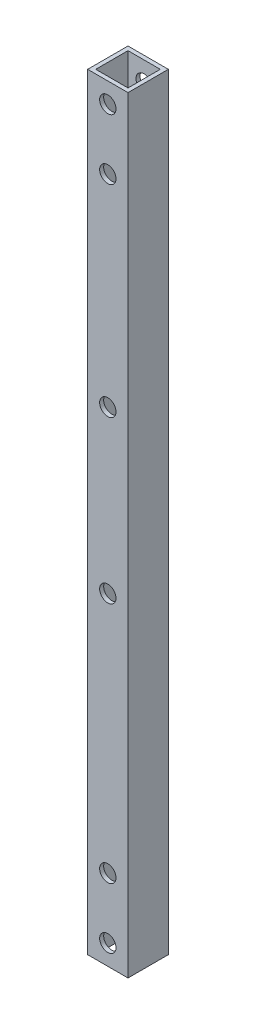
ISO-10303-21;
HEADER;
FILE_DESCRIPTION(('STEP AP214'),'2;1');
FILE_NAME('part.step','',(''),(''),'','','');
FILE_SCHEMA(('AUTOMOTIVE_DESIGN { 1 0 10303 214 1 1 1 1 }'));
ENDSEC;
DATA;
#1=APPLICATION_CONTEXT('core data for automotive mechanical design processes');
#2=APPLICATION_PROTOCOL_DEFINITION('international standard','automotive_design',2000,#1);
#3=PRODUCT_CONTEXT('',#1,'mechanical');
#4=PRODUCT('Part','Part','',(#3));
#5=PRODUCT_RELATED_PRODUCT_CATEGORY('part','',(#4));
#6=PRODUCT_DEFINITION_FORMATION('','',#4);
#7=PRODUCT_DEFINITION_CONTEXT('part definition',#1,'design');
#8=PRODUCT_DEFINITION('design','',#6,#7);
#9=PRODUCT_DEFINITION_SHAPE('','',#8);
#10=(LENGTH_UNIT() NAMED_UNIT(*) SI_UNIT(.MILLI.,.METRE.));
#11=(NAMED_UNIT(*) PLANE_ANGLE_UNIT() SI_UNIT($,.RADIAN.));
#12=(NAMED_UNIT(*) SI_UNIT($,.STERADIAN.) SOLID_ANGLE_UNIT());
#13=UNCERTAINTY_MEASURE_WITH_UNIT(LENGTH_MEASURE(1.E-05),#10,'distance_accuracy_value','');
#14=(GEOMETRIC_REPRESENTATION_CONTEXT(3) GLOBAL_UNCERTAINTY_ASSIGNED_CONTEXT((#13)) GLOBAL_UNIT_ASSIGNED_CONTEXT((#10,
#11,#12)) REPRESENTATION_CONTEXT('',''));
#15=CARTESIAN_POINT('',(0.,0.,0.));
#16=DIRECTION('',(0.,0.,1.));
#17=DIRECTION('',(1.,0.,0.));
#18=AXIS2_PLACEMENT_3D('',#15,#16,#17);
#19=CARTESIAN_POINT('',(0.,190.,0.));
#20=DIRECTION('',(0.,1.,0.));
#21=DIRECTION('',(0.,0.,1.));
#22=AXIS2_PLACEMENT_3D('',#19,#20,#21);
#23=PLANE('',#22);
#24=DIRECTION('',(0.,0.,-1.));
#25=VECTOR('',#24,1.);
#26=CARTESIAN_POINT('',(5.,190.,-5.));
#27=LINE('',#26,#25);
#28=CARTESIAN_POINT('',(5.,190.,5.));
#29=VERTEX_POINT('',#28);
#30=CARTESIAN_POINT('',(5.,190.,-5.));
#31=VERTEX_POINT('',#30);
#32=EDGE_CURVE('E157',#29,#31,#27,.T.);
#33=ORIENTED_EDGE('',*,*,#32,.T.);
#34=DIRECTION('',(-1.,0.,0.));
#35=VECTOR('',#34,1.);
#36=CARTESIAN_POINT('',(-5.,190.,-5.));
#37=LINE('',#36,#35);
#38=CARTESIAN_POINT('',(-5.,190.,-5.));
#39=VERTEX_POINT('',#38);
#40=EDGE_CURVE('E161',#31,#39,#37,.T.);
#41=ORIENTED_EDGE('',*,*,#40,.T.);
#42=DIRECTION('',(0.,0.,1.));
#43=VECTOR('',#42,1.);
#44=CARTESIAN_POINT('',(-5.,190.,-5.));
#45=LINE('',#44,#43);
#46=CARTESIAN_POINT('',(-5.,190.,5.));
#47=VERTEX_POINT('',#46);
#48=EDGE_CURVE('E165',#39,#47,#45,.T.);
#49=ORIENTED_EDGE('',*,*,#48,.T.);
#50=DIRECTION('',(1.,0.,0.));
#51=VECTOR('',#50,1.);
#52=CARTESIAN_POINT('',(-5.,190.,5.));
#53=LINE('',#52,#51);
#54=EDGE_CURVE('E168',#47,#29,#53,.T.);
#55=ORIENTED_EDGE('',*,*,#54,.T.);
#56=EDGE_LOOP('',(#33,#41,#49,#55));
#57=FACE_BOUND('',#56,.T.);
#58=DIRECTION('',(-1.,0.,0.));
#59=VECTOR('',#58,1.);
#60=CARTESIAN_POINT('',(-4.,190.,-4.));
#61=LINE('',#60,#59);
#62=CARTESIAN_POINT('',(4.,190.,-4.));
#63=VERTEX_POINT('',#62);
#64=CARTESIAN_POINT('',(-4.,190.,-4.));
#65=VERTEX_POINT('',#64);
#66=EDGE_CURVE('E116',#63,#65,#61,.T.);
#67=ORIENTED_EDGE('',*,*,#66,.F.);
#68=DIRECTION('',(0.,0.,-1.));
#69=VECTOR('',#68,1.);
#70=CARTESIAN_POINT('',(4.,190.,-4.));
#71=LINE('',#70,#69);
#72=CARTESIAN_POINT('',(4.,190.,4.));
#73=VERTEX_POINT('',#72);
#74=EDGE_CURVE('E107',#73,#63,#71,.T.);
#75=ORIENTED_EDGE('',*,*,#74,.F.);
#76=DIRECTION('',(1.,0.,0.));
#77=VECTOR('',#76,1.);
#78=CARTESIAN_POINT('',(-4.,190.,4.));
#79=LINE('',#78,#77);
#80=CARTESIAN_POINT('',(-4.,190.,4.));
#81=VERTEX_POINT('',#80);
#82=EDGE_CURVE('E133',#81,#73,#79,.T.);
#83=ORIENTED_EDGE('',*,*,#82,.F.);
#84=DIRECTION('',(0.,0.,1.));
#85=VECTOR('',#84,1.);
#86=CARTESIAN_POINT('',(-4.,190.,-4.));
#87=LINE('',#86,#85);
#88=EDGE_CURVE('E129',#65,#81,#87,.T.);
#89=ORIENTED_EDGE('',*,*,#88,.F.);
#90=EDGE_LOOP('',(#67,#75,#83,#89));
#91=FACE_BOUND('',#90,.T.);
#92=ADVANCED_FACE('F39',(#57,#91),#23,.T.);
#93=CARTESIAN_POINT('',(0.,0.,0.));
#94=DIRECTION('',(0.,1.,0.));
#95=DIRECTION('',(0.,0.,1.));
#96=AXIS2_PLACEMENT_3D('',#93,#94,#95);
#97=PLANE('',#96);
#98=DIRECTION('',(0.,0.,-1.));
#99=VECTOR('',#98,1.);
#100=CARTESIAN_POINT('',(5.,0.,-5.));
#101=LINE('',#100,#99);
#102=CARTESIAN_POINT('',(5.,0.,5.));
#103=VERTEX_POINT('',#102);
#104=CARTESIAN_POINT('',(5.,0.,-5.));
#105=VERTEX_POINT('',#104);
#106=EDGE_CURVE('E125',#103,#105,#101,.T.);
#107=ORIENTED_EDGE('',*,*,#106,.F.);
#108=DIRECTION('',(1.,0.,0.));
#109=VECTOR('',#108,1.);
#110=CARTESIAN_POINT('',(-5.,0.,5.));
#111=LINE('',#110,#109);
#112=CARTESIAN_POINT('',(-5.,0.,5.));
#113=VERTEX_POINT('',#112);
#114=EDGE_CURVE('E162',#113,#103,#111,.T.);
#115=ORIENTED_EDGE('',*,*,#114,.F.);
#116=DIRECTION('',(0.,0.,1.));
#117=VECTOR('',#116,1.);
#118=CARTESIAN_POINT('',(-5.,0.,-5.));
#119=LINE('',#118,#117);
#120=CARTESIAN_POINT('',(-5.,0.,-5.));
#121=VERTEX_POINT('',#120);
#122=EDGE_CURVE('E178',#121,#113,#119,.T.);
#123=ORIENTED_EDGE('',*,*,#122,.F.);
#124=DIRECTION('',(-1.,0.,0.));
#125=VECTOR('',#124,1.);
#126=CARTESIAN_POINT('',(-5.,0.,-5.));
#127=LINE('',#126,#125);
#128=EDGE_CURVE('E175',#105,#121,#127,.T.);
#129=ORIENTED_EDGE('',*,*,#128,.F.);
#130=EDGE_LOOP('',(#107,#115,#123,#129));
#131=FACE_BOUND('',#130,.T.);
#132=DIRECTION('',(0.,0.,-1.));
#133=VECTOR('',#132,1.);
#134=CARTESIAN_POINT('',(4.,0.,-4.));
#135=LINE('',#134,#133);
#136=CARTESIAN_POINT('',(4.,0.,4.));
#137=VERTEX_POINT('',#136);
#138=CARTESIAN_POINT('',(4.,0.,-4.));
#139=VERTEX_POINT('',#138);
#140=EDGE_CURVE('E65',#137,#139,#135,.T.);
#141=ORIENTED_EDGE('',*,*,#140,.T.);
#142=DIRECTION('',(-1.,0.,0.));
#143=VECTOR('',#142,1.);
#144=CARTESIAN_POINT('',(-4.,0.,-4.));
#145=LINE('',#144,#143);
#146=CARTESIAN_POINT('',(-4.,0.,-4.));
#147=VERTEX_POINT('',#146);
#148=EDGE_CURVE('E123',#139,#147,#145,.T.);
#149=ORIENTED_EDGE('',*,*,#148,.T.);
#150=DIRECTION('',(0.,0.,1.));
#151=VECTOR('',#150,1.);
#152=CARTESIAN_POINT('',(-4.,0.,-4.));
#153=LINE('',#152,#151);
#154=CARTESIAN_POINT('',(-4.,0.,4.));
#155=VERTEX_POINT('',#154);
#156=EDGE_CURVE('E144',#147,#155,#153,.T.);
#157=ORIENTED_EDGE('',*,*,#156,.T.);
#158=DIRECTION('',(1.,0.,0.));
#159=VECTOR('',#158,1.);
#160=CARTESIAN_POINT('',(-4.,0.,4.));
#161=LINE('',#160,#159);
#162=EDGE_CURVE('E117',#155,#137,#161,.T.);
#163=ORIENTED_EDGE('',*,*,#162,.T.);
#164=EDGE_LOOP('',(#141,#149,#157,#163));
#165=FACE_BOUND('',#164,.T.);
#166=ADVANCED_FACE('F287',(#131,#165),#97,.F.);
#167=CARTESIAN_POINT('',(5.,190.,-5.));
#168=DIRECTION('',(-1.,0.,0.));
#169=DIRECTION('',(0.,0.,1.));
#170=AXIS2_PLACEMENT_3D('',#167,#168,#169);
#171=PLANE('',#170);
#172=ORIENTED_EDGE('',*,*,#106,.T.);
#173=DIRECTION('',(0.,-1.,0.));
#174=VECTOR('',#173,1.);
#175=CARTESIAN_POINT('',(5.,190.,-5.));
#176=LINE('',#175,#174);
#177=EDGE_CURVE('E11',#31,#105,#176,.T.);
#178=ORIENTED_EDGE('',*,*,#177,.F.);
#179=ORIENTED_EDGE('',*,*,#32,.F.);
#180=DIRECTION('',(0.,-1.,0.));
#181=VECTOR('',#180,1.);
#182=CARTESIAN_POINT('',(5.,190.,5.));
#183=LINE('',#182,#181);
#184=EDGE_CURVE('E171',#29,#103,#183,.T.);
#185=ORIENTED_EDGE('',*,*,#184,.T.);
#186=EDGE_LOOP('',(#172,#178,#179,#185));
#187=FACE_BOUND('',#186,.T.);
#188=ADVANCED_FACE('F41',(#187),#171,.F.);
#189=CARTESIAN_POINT('',(-5.,190.,-5.));
#190=DIRECTION('',(0.,0.,1.));
#191=DIRECTION('',(1.,0.,0.));
#192=AXIS2_PLACEMENT_3D('',#189,#190,#191);
#193=PLANE('',#192);
#194=CARTESIAN_POINT('',(0.,185.,-5.));
#195=DIRECTION('',(0.,0.,1.));
#196=DIRECTION('',(1.,0.,0.));
#197=AXIS2_PLACEMENT_3D('',#194,#195,#196);
#198=CIRCLE('',#197,2.02499999999995);
#199=CARTESIAN_POINT('',(2.02499999999997,185.,-5.));
#200=VERTEX_POINT('',#199);
#201=EDGE_CURVE('E208',#200,#200,#198,.T.);
#202=ORIENTED_EDGE('',*,*,#201,.T.);
#203=EDGE_LOOP('',(#202));
#204=FACE_BOUND('',#203,.T.);
#205=CARTESIAN_POINT('',(0.,20.,-5.));
#206=DIRECTION('',(0.,0.,1.));
#207=DIRECTION('',(1.,0.,0.));
#208=AXIS2_PLACEMENT_3D('',#205,#206,#207);
#209=CIRCLE('',#208,2.025);
#210=CARTESIAN_POINT('',(2.02500000000004,20.,-5.));
#211=VERTEX_POINT('',#210);
#212=EDGE_CURVE('E491',#211,#211,#209,.T.);
#213=ORIENTED_EDGE('',*,*,#212,.T.);
#214=EDGE_LOOP('',(#213));
#215=FACE_BOUND('',#214,.T.);
#216=CARTESIAN_POINT('',(0.,5.,-5.));
#217=DIRECTION('',(0.,0.,1.));
#218=DIRECTION('',(1.,0.,0.));
#219=AXIS2_PLACEMENT_3D('',#216,#217,#218);
#220=CIRCLE('',#219,2.025);
#221=CARTESIAN_POINT('',(2.02500000000004,5.,-5.));
#222=VERTEX_POINT('',#221);
#223=EDGE_CURVE('E507',#222,#222,#220,.T.);
#224=ORIENTED_EDGE('',*,*,#223,.T.);
#225=EDGE_LOOP('',(#224));
#226=FACE_BOUND('',#225,.T.);
#227=CARTESIAN_POINT('',(0.,170.,-5.));
#228=DIRECTION('',(0.,0.,1.));
#229=DIRECTION('',(1.,0.,0.));
#230=AXIS2_PLACEMENT_3D('',#227,#228,#229);
#231=CIRCLE('',#230,2.02499999999995);
#232=CARTESIAN_POINT('',(2.02499999999997,170.,-5.));
#233=VERTEX_POINT('',#232);
#234=EDGE_CURVE('E488',#233,#233,#231,.T.);
#235=ORIENTED_EDGE('',*,*,#234,.T.);
#236=EDGE_LOOP('',(#235));
#237=FACE_BOUND('',#236,.T.);
#238=CARTESIAN_POINT('',(0.,120.,-5.));
#239=DIRECTION('',(0.,0.,1.));
#240=DIRECTION('',(1.,0.,0.));
#241=AXIS2_PLACEMENT_3D('',#238,#239,#240);
#242=CIRCLE('',#241,2.02500000000001);
#243=CARTESIAN_POINT('',(2.02500000000003,120.,-5.));
#244=VERTEX_POINT('',#243);
#245=EDGE_CURVE('E198',#244,#244,#242,.T.);
#246=ORIENTED_EDGE('',*,*,#245,.T.);
#247=EDGE_LOOP('',(#246));
#248=FACE_BOUND('',#247,.T.);
#249=CARTESIAN_POINT('',(0.,80.,-5.));
#250=DIRECTION('',(0.,0.,1.));
#251=DIRECTION('',(1.,0.,0.));
#252=AXIS2_PLACEMENT_3D('',#249,#250,#251);
#253=CIRCLE('',#252,2.02500000000001);
#254=CARTESIAN_POINT('',(2.02500000000003,80.,-5.));
#255=VERTEX_POINT('',#254);
#256=EDGE_CURVE('E242',#255,#255,#253,.T.);
#257=ORIENTED_EDGE('',*,*,#256,.T.);
#258=EDGE_LOOP('',(#257));
#259=FACE_BOUND('',#258,.T.);
#260=ORIENTED_EDGE('',*,*,#128,.T.);
#261=DIRECTION('',(0.,-1.,0.));
#262=VECTOR('',#261,1.);
#263=CARTESIAN_POINT('',(-5.,190.,-5.));
#264=LINE('',#263,#262);
#265=EDGE_CURVE('E49',#39,#121,#264,.T.);
#266=ORIENTED_EDGE('',*,*,#265,.F.);
#267=ORIENTED_EDGE('',*,*,#40,.F.);
#268=ORIENTED_EDGE('',*,*,#177,.T.);
#269=EDGE_LOOP('',(#260,#266,#267,#268));
#270=FACE_BOUND('',#269,.T.);
#271=ADVANCED_FACE('F273',(#204,#215,#226,#237,#248,#259,#270),#193,.F.);
#272=CARTESIAN_POINT('',(-5.,190.,-5.));
#273=DIRECTION('',(1.,0.,0.));
#274=DIRECTION('',(0.,0.,-1.));
#275=AXIS2_PLACEMENT_3D('',#272,#273,#274);
#276=PLANE('',#275);
#277=ORIENTED_EDGE('',*,*,#122,.T.);
#278=DIRECTION('',(0.,-1.,0.));
#279=VECTOR('',#278,1.);
#280=CARTESIAN_POINT('',(-5.,190.,5.));
#281=LINE('',#280,#279);
#282=EDGE_CURVE('E186',#47,#113,#281,.T.);
#283=ORIENTED_EDGE('',*,*,#282,.F.);
#284=ORIENTED_EDGE('',*,*,#48,.F.);
#285=ORIENTED_EDGE('',*,*,#265,.T.);
#286=EDGE_LOOP('',(#277,#283,#284,#285));
#287=FACE_BOUND('',#286,.T.);
#288=ADVANCED_FACE('F276',(#287),#276,.F.);
#289=CARTESIAN_POINT('',(-5.,190.,5.));
#290=DIRECTION('',(0.,0.,-1.));
#291=DIRECTION('',(-1.,0.,0.));
#292=AXIS2_PLACEMENT_3D('',#289,#290,#291);
#293=PLANE('',#292);
#294=CARTESIAN_POINT('',(0.,185.,5.));
#295=DIRECTION('',(0.,0.,1.));
#296=DIRECTION('',(1.,0.,0.));
#297=AXIS2_PLACEMENT_3D('',#294,#295,#296);
#298=CIRCLE('',#297,2.02499999999995);
#299=CARTESIAN_POINT('',(2.02499999999997,185.,5.));
#300=VERTEX_POINT('',#299);
#301=EDGE_CURVE('E484',#300,#300,#298,.T.);
#302=ORIENTED_EDGE('',*,*,#301,.F.);
#303=EDGE_LOOP('',(#302));
#304=FACE_BOUND('',#303,.T.);
#305=CARTESIAN_POINT('',(0.,20.,5.));
#306=DIRECTION('',(0.,0.,1.));
#307=DIRECTION('',(1.,0.,0.));
#308=AXIS2_PLACEMENT_3D('',#305,#306,#307);
#309=CIRCLE('',#308,2.025);
#310=CARTESIAN_POINT('',(2.02500000000004,20.,5.));
#311=VERTEX_POINT('',#310);
#312=EDGE_CURVE('E496',#311,#311,#309,.T.);
#313=ORIENTED_EDGE('',*,*,#312,.F.);
#314=EDGE_LOOP('',(#313));
#315=FACE_BOUND('',#314,.T.);
#316=CARTESIAN_POINT('',(0.,5.,5.));
#317=DIRECTION('',(0.,0.,1.));
#318=DIRECTION('',(1.,0.,0.));
#319=AXIS2_PLACEMENT_3D('',#316,#317,#318);
#320=CIRCLE('',#319,2.025);
#321=CARTESIAN_POINT('',(2.02500000000004,5.,5.));
#322=VERTEX_POINT('',#321);
#323=EDGE_CURVE('E495',#322,#322,#320,.T.);
#324=ORIENTED_EDGE('',*,*,#323,.F.);
#325=EDGE_LOOP('',(#324));
#326=FACE_BOUND('',#325,.T.);
#327=CARTESIAN_POINT('',(0.,170.,5.));
#328=DIRECTION('',(0.,0.,1.));
#329=DIRECTION('',(1.,0.,0.));
#330=AXIS2_PLACEMENT_3D('',#327,#328,#329);
#331=CIRCLE('',#330,2.02499999999995);
#332=CARTESIAN_POINT('',(2.02499999999997,170.,5.));
#333=VERTEX_POINT('',#332);
#334=EDGE_CURVE('E503',#333,#333,#331,.T.);
#335=ORIENTED_EDGE('',*,*,#334,.F.);
#336=EDGE_LOOP('',(#335));
#337=FACE_BOUND('',#336,.T.);
#338=CARTESIAN_POINT('',(0.,120.,5.));
#339=DIRECTION('',(0.,0.,1.));
#340=DIRECTION('',(1.,0.,0.));
#341=AXIS2_PLACEMENT_3D('',#338,#339,#340);
#342=CIRCLE('',#341,2.02500000000001);
#343=CARTESIAN_POINT('',(2.02500000000003,120.,5.));
#344=VERTEX_POINT('',#343);
#345=EDGE_CURVE('E238',#344,#344,#342,.T.);
#346=ORIENTED_EDGE('',*,*,#345,.F.);
#347=EDGE_LOOP('',(#346));
#348=FACE_BOUND('',#347,.T.);
#349=CARTESIAN_POINT('',(0.,80.,5.));
#350=DIRECTION('',(0.,0.,1.));
#351=DIRECTION('',(1.,0.,0.));
#352=AXIS2_PLACEMENT_3D('',#349,#350,#351);
#353=CIRCLE('',#352,2.02500000000001);
#354=CARTESIAN_POINT('',(2.02500000000003,80.,5.));
#355=VERTEX_POINT('',#354);
#356=EDGE_CURVE('E234',#355,#355,#353,.T.);
#357=ORIENTED_EDGE('',*,*,#356,.F.);
#358=EDGE_LOOP('',(#357));
#359=FACE_BOUND('',#358,.T.);
#360=ORIENTED_EDGE('',*,*,#114,.T.);
#361=ORIENTED_EDGE('',*,*,#184,.F.);
#362=ORIENTED_EDGE('',*,*,#54,.F.);
#363=ORIENTED_EDGE('',*,*,#282,.T.);
#364=EDGE_LOOP('',(#360,#361,#362,#363));
#365=FACE_BOUND('',#364,.T.);
#366=ADVANCED_FACE('F291',(#304,#315,#326,#337,#348,#359,#365),#293,.F.);
#367=CARTESIAN_POINT('',(4.,190.,-4.));
#368=DIRECTION('',(-1.,0.,0.));
#369=DIRECTION('',(0.,0.,1.));
#370=AXIS2_PLACEMENT_3D('',#367,#368,#369);
#371=PLANE('',#370);
#372=ORIENTED_EDGE('',*,*,#140,.F.);
#373=DIRECTION('',(0.,-1.,0.));
#374=VECTOR('',#373,1.);
#375=CARTESIAN_POINT('',(4.,190.,4.));
#376=LINE('',#375,#374);
#377=EDGE_CURVE('E111',#73,#137,#376,.T.);
#378=ORIENTED_EDGE('',*,*,#377,.F.);
#379=ORIENTED_EDGE('',*,*,#74,.T.);
#380=DIRECTION('',(0.,-1.,0.));
#381=VECTOR('',#380,1.);
#382=CARTESIAN_POINT('',(4.,190.,-4.));
#383=LINE('',#382,#381);
#384=EDGE_CURVE('E110',#63,#139,#383,.T.);
#385=ORIENTED_EDGE('',*,*,#384,.T.);
#386=EDGE_LOOP('',(#372,#378,#379,#385));
#387=FACE_BOUND('',#386,.T.);
#388=ADVANCED_FACE('F109',(#387),#371,.T.);
#389=CARTESIAN_POINT('',(-4.,190.,-4.));
#390=DIRECTION('',(0.,0.,1.));
#391=DIRECTION('',(1.,0.,0.));
#392=AXIS2_PLACEMENT_3D('',#389,#390,#391);
#393=PLANE('',#392);
#394=CARTESIAN_POINT('',(0.,185.,-4.));
#395=DIRECTION('',(0.,0.,1.));
#396=DIRECTION('',(1.,0.,0.));
#397=AXIS2_PLACEMENT_3D('',#394,#395,#396);
#398=CIRCLE('',#397,2.02499999999995);
#399=CARTESIAN_POINT('',(2.02499999999997,185.,-4.));
#400=VERTEX_POINT('',#399);
#401=EDGE_CURVE('E230',#400,#400,#398,.T.);
#402=ORIENTED_EDGE('',*,*,#401,.F.);
#403=EDGE_LOOP('',(#402));
#404=FACE_BOUND('',#403,.T.);
#405=CARTESIAN_POINT('',(0.,20.,-4.));
#406=DIRECTION('',(0.,0.,1.));
#407=DIRECTION('',(1.,0.,0.));
#408=AXIS2_PLACEMENT_3D('',#405,#406,#407);
#409=CIRCLE('',#408,2.025);
#410=CARTESIAN_POINT('',(2.02500000000004,20.,-4.));
#411=VERTEX_POINT('',#410);
#412=EDGE_CURVE('E216',#411,#411,#409,.T.);
#413=ORIENTED_EDGE('',*,*,#412,.F.);
#414=EDGE_LOOP('',(#413));
#415=FACE_BOUND('',#414,.T.);
#416=CARTESIAN_POINT('',(0.,5.,-4.));
#417=DIRECTION('',(0.,0.,1.));
#418=DIRECTION('',(1.,0.,0.));
#419=AXIS2_PLACEMENT_3D('',#416,#417,#418);
#420=CIRCLE('',#419,2.025);
#421=CARTESIAN_POINT('',(2.02500000000004,5.,-4.));
#422=VERTEX_POINT('',#421);
#423=EDGE_CURVE('E212',#422,#422,#420,.T.);
#424=ORIENTED_EDGE('',*,*,#423,.F.);
#425=EDGE_LOOP('',(#424));
#426=FACE_BOUND('',#425,.T.);
#427=CARTESIAN_POINT('',(0.,170.,-4.));
#428=DIRECTION('',(0.,0.,1.));
#429=DIRECTION('',(1.,0.,0.));
#430=AXIS2_PLACEMENT_3D('',#427,#428,#429);
#431=CIRCLE('',#430,2.02499999999995);
#432=CARTESIAN_POINT('',(2.02499999999997,170.,-4.));
#433=VERTEX_POINT('',#432);
#434=EDGE_CURVE('E207',#433,#433,#431,.T.);
#435=ORIENTED_EDGE('',*,*,#434,.F.);
#436=EDGE_LOOP('',(#435));
#437=FACE_BOUND('',#436,.T.);
#438=CARTESIAN_POINT('',(0.,120.,-4.));
#439=DIRECTION('',(0.,0.,1.));
#440=DIRECTION('',(1.,0.,0.));
#441=AXIS2_PLACEMENT_3D('',#438,#439,#440);
#442=CIRCLE('',#441,2.02500000000001);
#443=CARTESIAN_POINT('',(2.02500000000003,120.,-4.));
#444=VERTEX_POINT('',#443);
#445=EDGE_CURVE('E141',#444,#444,#442,.T.);
#446=ORIENTED_EDGE('',*,*,#445,.F.);
#447=EDGE_LOOP('',(#446));
#448=FACE_BOUND('',#447,.T.);
#449=CARTESIAN_POINT('',(0.,80.,-4.));
#450=DIRECTION('',(0.,0.,1.));
#451=DIRECTION('',(1.,0.,0.));
#452=AXIS2_PLACEMENT_3D('',#449,#450,#451);
#453=CIRCLE('',#452,2.02500000000001);
#454=CARTESIAN_POINT('',(2.02500000000003,80.,-4.));
#455=VERTEX_POINT('',#454);
#456=EDGE_CURVE('E197',#455,#455,#453,.T.);
#457=ORIENTED_EDGE('',*,*,#456,.F.);
#458=EDGE_LOOP('',(#457));
#459=FACE_BOUND('',#458,.T.);
#460=ORIENTED_EDGE('',*,*,#148,.F.);
#461=ORIENTED_EDGE('',*,*,#384,.F.);
#462=ORIENTED_EDGE('',*,*,#66,.T.);
#463=DIRECTION('',(0.,-1.,0.));
#464=VECTOR('',#463,1.);
#465=CARTESIAN_POINT('',(-4.,190.,-4.));
#466=LINE('',#465,#464);
#467=EDGE_CURVE('E126',#65,#147,#466,.T.);
#468=ORIENTED_EDGE('',*,*,#467,.T.);
#469=EDGE_LOOP('',(#460,#461,#462,#468));
#470=FACE_BOUND('',#469,.T.);
#471=ADVANCED_FACE('F120',(#404,#415,#426,#437,#448,#459,#470),#393,.T.);
#472=CARTESIAN_POINT('',(-4.,190.,-4.));
#473=DIRECTION('',(1.,0.,0.));
#474=DIRECTION('',(0.,0.,-1.));
#475=AXIS2_PLACEMENT_3D('',#472,#473,#474);
#476=PLANE('',#475);
#477=ORIENTED_EDGE('',*,*,#156,.F.);
#478=ORIENTED_EDGE('',*,*,#467,.F.);
#479=ORIENTED_EDGE('',*,*,#88,.T.);
#480=DIRECTION('',(0.,-1.,0.));
#481=VECTOR('',#480,1.);
#482=CARTESIAN_POINT('',(-4.,190.,4.));
#483=LINE('',#482,#481);
#484=EDGE_CURVE('E57',#81,#155,#483,.T.);
#485=ORIENTED_EDGE('',*,*,#484,.T.);
#486=EDGE_LOOP('',(#477,#478,#479,#485));
#487=FACE_BOUND('',#486,.T.);
#488=ADVANCED_FACE('F260',(#487),#476,.T.);
#489=CARTESIAN_POINT('',(-4.,190.,4.));
#490=DIRECTION('',(0.,0.,-1.));
#491=DIRECTION('',(-1.,0.,0.));
#492=AXIS2_PLACEMENT_3D('',#489,#490,#491);
#493=PLANE('',#492);
#494=CARTESIAN_POINT('',(0.,185.,4.));
#495=DIRECTION('',(0.,0.,-1.));
#496=DIRECTION('',(-1.,0.,0.));
#497=AXIS2_PLACEMENT_3D('',#494,#495,#496);
#498=CIRCLE('',#497,2.02499999999995);
#499=CARTESIAN_POINT('',(-2.02499999999994,185.,4.));
#500=VERTEX_POINT('',#499);
#501=EDGE_CURVE('E43',#500,#500,#498,.T.);
#502=ORIENTED_EDGE('',*,*,#501,.F.);
#503=EDGE_LOOP('',(#502));
#504=FACE_BOUND('',#503,.T.);
#505=CARTESIAN_POINT('',(0.,20.,4.));
#506=DIRECTION('',(0.,0.,-1.));
#507=DIRECTION('',(-1.,0.,0.));
#508=AXIS2_PLACEMENT_3D('',#505,#506,#507);
#509=CIRCLE('',#508,2.025);
#510=CARTESIAN_POINT('',(-2.02499999999996,20.,4.));
#511=VERTEX_POINT('',#510);
#512=EDGE_CURVE('E213',#511,#511,#509,.T.);
#513=ORIENTED_EDGE('',*,*,#512,.F.);
#514=EDGE_LOOP('',(#513));
#515=FACE_BOUND('',#514,.T.);
#516=CARTESIAN_POINT('',(0.,5.,4.));
#517=DIRECTION('',(0.,0.,-1.));
#518=DIRECTION('',(-1.,0.,0.));
#519=AXIS2_PLACEMENT_3D('',#516,#517,#518);
#520=CIRCLE('',#519,2.025);
#521=CARTESIAN_POINT('',(-2.02499999999996,5.,4.));
#522=VERTEX_POINT('',#521);
#523=EDGE_CURVE('E209',#522,#522,#520,.T.);
#524=ORIENTED_EDGE('',*,*,#523,.F.);
#525=EDGE_LOOP('',(#524));
#526=FACE_BOUND('',#525,.T.);
#527=CARTESIAN_POINT('',(0.,170.,4.));
#528=DIRECTION('',(0.,0.,-1.));
#529=DIRECTION('',(-1.,0.,0.));
#530=AXIS2_PLACEMENT_3D('',#527,#528,#529);
#531=CIRCLE('',#530,2.02499999999995);
#532=CARTESIAN_POINT('',(-2.02499999999993,170.,4.));
#533=VERTEX_POINT('',#532);
#534=EDGE_CURVE('E203',#533,#533,#531,.T.);
#535=ORIENTED_EDGE('',*,*,#534,.F.);
#536=EDGE_LOOP('',(#535));
#537=FACE_BOUND('',#536,.T.);
#538=CARTESIAN_POINT('',(0.,120.,4.));
#539=DIRECTION('',(0.,0.,-1.));
#540=DIRECTION('',(-1.,0.,0.));
#541=AXIS2_PLACEMENT_3D('',#538,#539,#540);
#542=CIRCLE('',#541,2.02500000000001);
#543=CARTESIAN_POINT('',(-2.02499999999999,120.,4.));
#544=VERTEX_POINT('',#543);
#545=EDGE_CURVE('E199',#544,#544,#542,.T.);
#546=ORIENTED_EDGE('',*,*,#545,.F.);
#547=EDGE_LOOP('',(#546));
#548=FACE_BOUND('',#547,.T.);
#549=CARTESIAN_POINT('',(0.,80.,4.));
#550=DIRECTION('',(0.,0.,-1.));
#551=DIRECTION('',(-1.,0.,0.));
#552=AXIS2_PLACEMENT_3D('',#549,#550,#551);
#553=CIRCLE('',#552,2.02500000000001);
#554=CARTESIAN_POINT('',(-2.02499999999998,80.,4.));
#555=VERTEX_POINT('',#554);
#556=EDGE_CURVE('E193',#555,#555,#553,.T.);
#557=ORIENTED_EDGE('',*,*,#556,.F.);
#558=EDGE_LOOP('',(#557));
#559=FACE_BOUND('',#558,.T.);
#560=ORIENTED_EDGE('',*,*,#162,.F.);
#561=ORIENTED_EDGE('',*,*,#484,.F.);
#562=ORIENTED_EDGE('',*,*,#82,.T.);
#563=ORIENTED_EDGE('',*,*,#377,.T.);
#564=EDGE_LOOP('',(#560,#561,#562,#563));
#565=FACE_BOUND('',#564,.T.);
#566=ADVANCED_FACE('F334',(#504,#515,#526,#537,#548,#559,#565),#493,.T.);
#567=CARTESIAN_POINT('',(0.,80.,-5.));
#568=DIRECTION('',(0.,0.,1.));
#569=DIRECTION('',(1.,0.,0.));
#570=AXIS2_PLACEMENT_3D('',#567,#568,#569);
#571=CYLINDRICAL_SURFACE('',#570,2.02500000000001);
#572=ORIENTED_EDGE('',*,*,#556,.T.);
#573=EDGE_LOOP('',(#572));
#574=FACE_BOUND('',#573,.T.);
#575=ORIENTED_EDGE('',*,*,#356,.T.);
#576=EDGE_LOOP('',(#575));
#577=FACE_BOUND('',#576,.T.);
#578=ADVANCED_FACE('F270',(#574,#577),#571,.F.);
#579=CARTESIAN_POINT('',(0.,120.,-5.));
#580=DIRECTION('',(0.,0.,1.));
#581=DIRECTION('',(1.,0.,0.));
#582=AXIS2_PLACEMENT_3D('',#579,#580,#581);
#583=CYLINDRICAL_SURFACE('',#582,2.02500000000001);
#584=ORIENTED_EDGE('',*,*,#545,.T.);
#585=EDGE_LOOP('',(#584));
#586=FACE_BOUND('',#585,.T.);
#587=ORIENTED_EDGE('',*,*,#345,.T.);
#588=EDGE_LOOP('',(#587));
#589=FACE_BOUND('',#588,.T.);
#590=ADVANCED_FACE('F268',(#586,#589),#583,.F.);
#591=ORIENTED_EDGE('',*,*,#456,.T.);
#592=EDGE_LOOP('',(#591));
#593=FACE_BOUND('',#592,.T.);
#594=ORIENTED_EDGE('',*,*,#256,.F.);
#595=EDGE_LOOP('',(#594));
#596=FACE_BOUND('',#595,.T.);
#597=ADVANCED_FACE('F265',(#593,#596),#571,.F.);
#598=ORIENTED_EDGE('',*,*,#445,.T.);
#599=EDGE_LOOP('',(#598));
#600=FACE_BOUND('',#599,.T.);
#601=ORIENTED_EDGE('',*,*,#245,.F.);
#602=EDGE_LOOP('',(#601));
#603=FACE_BOUND('',#602,.T.);
#604=ADVANCED_FACE('F255',(#600,#603),#583,.F.);
#605=CARTESIAN_POINT('',(0.,170.,-5.));
#606=DIRECTION('',(0.,0.,1.));
#607=DIRECTION('',(1.,0.,0.));
#608=AXIS2_PLACEMENT_3D('',#605,#606,#607);
#609=CYLINDRICAL_SURFACE('',#608,2.02499999999995);
#610=ORIENTED_EDGE('',*,*,#534,.T.);
#611=EDGE_LOOP('',(#610));
#612=FACE_BOUND('',#611,.T.);
#613=ORIENTED_EDGE('',*,*,#334,.T.);
#614=EDGE_LOOP('',(#613));
#615=FACE_BOUND('',#614,.T.);
#616=ADVANCED_FACE('F366',(#612,#615),#609,.F.);
#617=CARTESIAN_POINT('',(0.,5.,-5.));
#618=DIRECTION('',(0.,0.,1.));
#619=DIRECTION('',(1.,0.,0.));
#620=AXIS2_PLACEMENT_3D('',#617,#618,#619);
#621=CYLINDRICAL_SURFACE('',#620,2.025);
#622=ORIENTED_EDGE('',*,*,#523,.T.);
#623=EDGE_LOOP('',(#622));
#624=FACE_BOUND('',#623,.T.);
#625=ORIENTED_EDGE('',*,*,#323,.T.);
#626=EDGE_LOOP('',(#625));
#627=FACE_BOUND('',#626,.T.);
#628=ADVANCED_FACE('F371',(#624,#627),#621,.F.);
#629=CARTESIAN_POINT('',(0.,20.,-5.));
#630=DIRECTION('',(0.,0.,1.));
#631=DIRECTION('',(1.,0.,0.));
#632=AXIS2_PLACEMENT_3D('',#629,#630,#631);
#633=CYLINDRICAL_SURFACE('',#632,2.025);
#634=ORIENTED_EDGE('',*,*,#512,.T.);
#635=EDGE_LOOP('',(#634));
#636=FACE_BOUND('',#635,.T.);
#637=ORIENTED_EDGE('',*,*,#312,.T.);
#638=EDGE_LOOP('',(#637));
#639=FACE_BOUND('',#638,.T.);
#640=ADVANCED_FACE('F380',(#636,#639),#633,.F.);
#641=CARTESIAN_POINT('',(0.,185.,-5.));
#642=DIRECTION('',(0.,0.,1.));
#643=DIRECTION('',(1.,0.,0.));
#644=AXIS2_PLACEMENT_3D('',#641,#642,#643);
#645=CYLINDRICAL_SURFACE('',#644,2.02499999999995);
#646=ORIENTED_EDGE('',*,*,#501,.T.);
#647=EDGE_LOOP('',(#646));
#648=FACE_BOUND('',#647,.T.);
#649=ORIENTED_EDGE('',*,*,#301,.T.);
#650=EDGE_LOOP('',(#649));
#651=FACE_BOUND('',#650,.T.);
#652=ADVANCED_FACE('F389',(#648,#651),#645,.F.);
#653=ORIENTED_EDGE('',*,*,#434,.T.);
#654=EDGE_LOOP('',(#653));
#655=FACE_BOUND('',#654,.T.);
#656=ORIENTED_EDGE('',*,*,#234,.F.);
#657=EDGE_LOOP('',(#656));
#658=FACE_BOUND('',#657,.T.);
#659=ADVANCED_FACE('F374',(#655,#658),#609,.F.);
#660=ORIENTED_EDGE('',*,*,#423,.T.);
#661=EDGE_LOOP('',(#660));
#662=FACE_BOUND('',#661,.T.);
#663=ORIENTED_EDGE('',*,*,#223,.F.);
#664=EDGE_LOOP('',(#663));
#665=FACE_BOUND('',#664,.T.);
#666=ADVANCED_FACE('F383',(#662,#665),#621,.F.);
#667=ORIENTED_EDGE('',*,*,#412,.T.);
#668=EDGE_LOOP('',(#667));
#669=FACE_BOUND('',#668,.T.);
#670=ORIENTED_EDGE('',*,*,#212,.F.);
#671=EDGE_LOOP('',(#670));
#672=FACE_BOUND('',#671,.T.);
#673=ADVANCED_FACE('F391',(#669,#672),#633,.F.);
#674=ORIENTED_EDGE('',*,*,#401,.T.);
#675=EDGE_LOOP('',(#674));
#676=FACE_BOUND('',#675,.T.);
#677=ORIENTED_EDGE('',*,*,#201,.F.);
#678=EDGE_LOOP('',(#677));
#679=FACE_BOUND('',#678,.T.);
#680=ADVANCED_FACE('F399',(#676,#679),#645,.F.);
#681=CLOSED_SHELL('',(#92,#166,#188,#271,#288,#366,#388,#471,#488,#566,#578,#590,#597,#604,#616,
#628,#640,#652,#659,#666,#673,#680));
#682=MANIFOLD_SOLID_BREP('B2',#681);
#683=ADVANCED_BREP_SHAPE_REPRESENTATION('',(#18,#682),#14);
#684=SHAPE_DEFINITION_REPRESENTATION(#9,#683);
ENDSEC;
END-ISO-10303-21;
